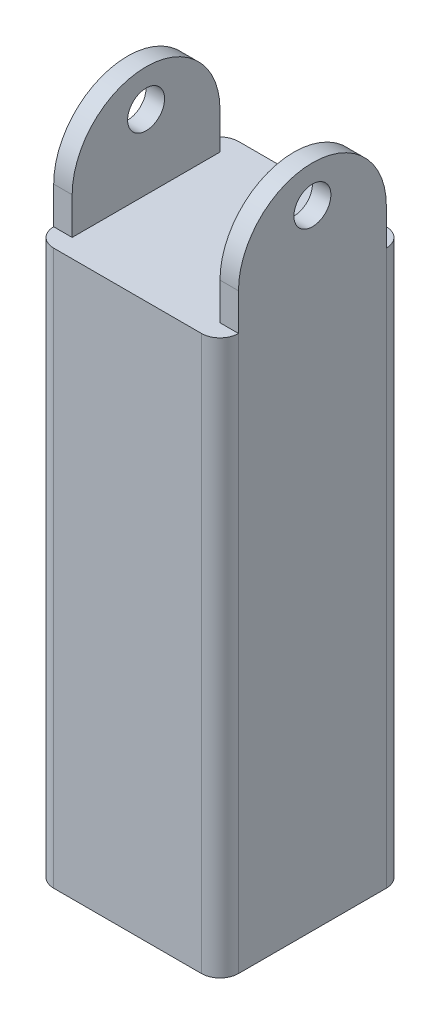
ISO-10303-21;
HEADER;
FILE_DESCRIPTION(('STEP AP214'),'2;1');
FILE_NAME('part.step','',(''),(''),'','','');
FILE_SCHEMA(('AUTOMOTIVE_DESIGN { 1 0 10303 214 1 1 1 1 }'));
ENDSEC;
DATA;
#1=APPLICATION_CONTEXT('core data for automotive mechanical design processes');
#2=APPLICATION_PROTOCOL_DEFINITION('international standard','automotive_design',2000,#1);
#3=PRODUCT_CONTEXT('',#1,'mechanical');
#4=PRODUCT('Part','Part','',(#3));
#5=PRODUCT_RELATED_PRODUCT_CATEGORY('part','',(#4));
#6=PRODUCT_DEFINITION_FORMATION('','',#4);
#7=PRODUCT_DEFINITION_CONTEXT('part definition',#1,'design');
#8=PRODUCT_DEFINITION('design','',#6,#7);
#9=PRODUCT_DEFINITION_SHAPE('','',#8);
#10=(LENGTH_UNIT() NAMED_UNIT(*) SI_UNIT(.MILLI.,.METRE.));
#11=(NAMED_UNIT(*) PLANE_ANGLE_UNIT() SI_UNIT($,.RADIAN.));
#12=(NAMED_UNIT(*) SI_UNIT($,.STERADIAN.) SOLID_ANGLE_UNIT());
#13=UNCERTAINTY_MEASURE_WITH_UNIT(LENGTH_MEASURE(1.E-05),#10,'distance_accuracy_value','');
#14=(GEOMETRIC_REPRESENTATION_CONTEXT(3) GLOBAL_UNCERTAINTY_ASSIGNED_CONTEXT((#13)) GLOBAL_UNIT_ASSIGNED_CONTEXT((#10,
#11,#12)) REPRESENTATION_CONTEXT('',''));
#15=CARTESIAN_POINT('',(0.,0.,0.));
#16=DIRECTION('',(0.,0.,1.));
#17=DIRECTION('',(1.,0.,0.));
#18=AXIS2_PLACEMENT_3D('',#15,#16,#17);
#19=CARTESIAN_POINT('',(-40.,320.,0.));
#20=DIRECTION('',(-1.,0.,0.));
#21=DIRECTION('',(0.,0.,1.));
#22=AXIS2_PLACEMENT_3D('',#19,#20,#21);
#23=CYLINDRICAL_SURFACE('',#22,40.);
#24=DIRECTION('',(-1.,0.,0.));
#25=VECTOR('',#24,1.);
#26=CARTESIAN_POINT('',(-40.,320.,40.));
#27=LINE('',#26,#25);
#28=CARTESIAN_POINT('',(-40.,320.,40.));
#29=VERTEX_POINT('',#28);
#30=CARTESIAN_POINT('',(-50.,320.,40.));
#31=VERTEX_POINT('',#30);
#32=EDGE_CURVE('E268',#29,#31,#27,.T.);
#33=ORIENTED_EDGE('',*,*,#32,.F.);
#34=CARTESIAN_POINT('',(-40.,320.,0.));
#35=DIRECTION('',(1.,0.,0.));
#36=DIRECTION('',(0.,0.,-1.));
#37=AXIS2_PLACEMENT_3D('',#34,#35,#36);
#38=CIRCLE('',#37,40.);
#39=CARTESIAN_POINT('',(-40.,320.,-40.));
#40=VERTEX_POINT('',#39);
#41=EDGE_CURVE('E56',#40,#29,#38,.T.);
#42=ORIENTED_EDGE('',*,*,#41,.F.);
#43=DIRECTION('',(-1.,0.,0.));
#44=VECTOR('',#43,1.);
#45=CARTESIAN_POINT('',(-40.,320.,-40.));
#46=LINE('',#45,#44);
#47=CARTESIAN_POINT('',(-50.,320.,-40.));
#48=VERTEX_POINT('',#47);
#49=EDGE_CURVE('E163',#48,#40,#46,.F.);
#50=ORIENTED_EDGE('',*,*,#49,.F.);
#51=CARTESIAN_POINT('',(-50.,320.,0.));
#52=DIRECTION('',(1.,0.,0.));
#53=DIRECTION('',(0.,0.,-1.));
#54=AXIS2_PLACEMENT_3D('',#51,#52,#53);
#55=CIRCLE('',#54,40.);
#56=EDGE_CURVE('E13',#31,#48,#55,.F.);
#57=ORIENTED_EDGE('',*,*,#56,.F.);
#58=EDGE_LOOP('',(#33,#42,#50,#57));
#59=FACE_BOUND('',#58,.T.);
#60=ADVANCED_FACE('F48',(#59),#23,.T.);
#61=CARTESIAN_POINT('',(0.,300.,0.));
#62=DIRECTION('',(0.,1.,0.));
#63=DIRECTION('',(0.,0.,1.));
#64=AXIS2_PLACEMENT_3D('',#61,#62,#63);
#65=PLANE('',#64);
#66=CARTESIAN_POINT('',(-40.,300.,-40.));
#67=DIRECTION('',(0.,1.,0.));
#68=DIRECTION('',(0.,0.,1.));
#69=AXIS2_PLACEMENT_3D('',#66,#67,#68);
#70=CIRCLE('',#69,10.);
#71=CARTESIAN_POINT('',(-40.,300.,-50.));
#72=VERTEX_POINT('',#71);
#73=CARTESIAN_POINT('',(-50.,300.,-40.));
#74=VERTEX_POINT('',#73);
#75=EDGE_CURVE('E170',#72,#74,#70,.T.);
#76=ORIENTED_EDGE('',*,*,#75,.T.);
#77=DIRECTION('',(-1.,0.,0.));
#78=VECTOR('',#77,1.);
#79=CARTESIAN_POINT('',(-40.,300.,-40.));
#80=LINE('',#79,#78);
#81=CARTESIAN_POINT('',(-40.,300.,-40.));
#82=VERTEX_POINT('',#81);
#83=EDGE_CURVE('E162',#82,#74,#80,.T.);
#84=ORIENTED_EDGE('',*,*,#83,.F.);
#85=DIRECTION('',(0.,0.,-1.));
#86=VECTOR('',#85,1.);
#87=CARTESIAN_POINT('',(-40.,300.,-40.));
#88=LINE('',#87,#86);
#89=CARTESIAN_POINT('',(-40.,300.,40.));
#90=VERTEX_POINT('',#89);
#91=EDGE_CURVE('E147',#90,#82,#88,.T.);
#92=ORIENTED_EDGE('',*,*,#91,.F.);
#93=DIRECTION('',(-1.,0.,0.));
#94=VECTOR('',#93,1.);
#95=CARTESIAN_POINT('',(-40.,300.,40.));
#96=LINE('',#95,#94);
#97=CARTESIAN_POINT('',(-50.,300.,40.));
#98=VERTEX_POINT('',#97);
#99=EDGE_CURVE('E172',#90,#98,#96,.T.);
#100=ORIENTED_EDGE('',*,*,#99,.T.);
#101=CARTESIAN_POINT('',(-40.,300.,40.));
#102=DIRECTION('',(0.,1.,0.));
#103=DIRECTION('',(0.,0.,1.));
#104=AXIS2_PLACEMENT_3D('',#101,#102,#103);
#105=CIRCLE('',#104,10.);
#106=CARTESIAN_POINT('',(-40.,300.,50.));
#107=VERTEX_POINT('',#106);
#108=EDGE_CURVE('E245',#98,#107,#105,.T.);
#109=ORIENTED_EDGE('',*,*,#108,.T.);
#110=DIRECTION('',(1.,0.,0.));
#111=VECTOR('',#110,1.);
#112=CARTESIAN_POINT('',(-50.,300.,50.));
#113=LINE('',#112,#111);
#114=CARTESIAN_POINT('',(40.,300.,50.));
#115=VERTEX_POINT('',#114);
#116=EDGE_CURVE('E206',#107,#115,#113,.T.);
#117=ORIENTED_EDGE('',*,*,#116,.T.);
#118=CARTESIAN_POINT('',(40.,300.,40.));
#119=DIRECTION('',(0.,1.,0.));
#120=DIRECTION('',(0.,0.,1.));
#121=AXIS2_PLACEMENT_3D('',#118,#119,#120);
#122=CIRCLE('',#121,10.);
#123=CARTESIAN_POINT('',(50.,300.,40.));
#124=VERTEX_POINT('',#123);
#125=EDGE_CURVE('E239',#115,#124,#122,.T.);
#126=ORIENTED_EDGE('',*,*,#125,.T.);
#127=DIRECTION('',(1.,0.,0.));
#128=VECTOR('',#127,1.);
#129=CARTESIAN_POINT('',(40.,300.,40.));
#130=LINE('',#129,#128);
#131=CARTESIAN_POINT('',(40.,300.,40.));
#132=VERTEX_POINT('',#131);
#133=EDGE_CURVE('E194',#132,#124,#130,.T.);
#134=ORIENTED_EDGE('',*,*,#133,.F.);
#135=DIRECTION('',(0.,0.,-1.));
#136=VECTOR('',#135,1.);
#137=CARTESIAN_POINT('',(40.,300.,-40.));
#138=LINE('',#137,#136);
#139=CARTESIAN_POINT('',(40.,300.,-40.));
#140=VERTEX_POINT('',#139);
#141=EDGE_CURVE('E191',#132,#140,#138,.T.);
#142=ORIENTED_EDGE('',*,*,#141,.T.);
#143=DIRECTION('',(1.,0.,0.));
#144=VECTOR('',#143,1.);
#145=CARTESIAN_POINT('',(40.,300.,-40.));
#146=LINE('',#145,#144);
#147=CARTESIAN_POINT('',(50.,300.,-40.));
#148=VERTEX_POINT('',#147);
#149=EDGE_CURVE('E198',#140,#148,#146,.T.);
#150=ORIENTED_EDGE('',*,*,#149,.T.);
#151=CARTESIAN_POINT('',(40.,300.,-40.));
#152=DIRECTION('',(0.,1.,0.));
#153=DIRECTION('',(0.,0.,1.));
#154=AXIS2_PLACEMENT_3D('',#151,#152,#153);
#155=CIRCLE('',#154,10.);
#156=CARTESIAN_POINT('',(40.,300.,-50.));
#157=VERTEX_POINT('',#156);
#158=EDGE_CURVE('E242',#148,#157,#155,.T.);
#159=ORIENTED_EDGE('',*,*,#158,.T.);
#160=DIRECTION('',(-1.,0.,0.));
#161=VECTOR('',#160,1.);
#162=CARTESIAN_POINT('',(-50.,300.,-50.));
#163=LINE('',#162,#161);
#164=EDGE_CURVE('E204',#157,#72,#163,.T.);
#165=ORIENTED_EDGE('',*,*,#164,.T.);
#166=EDGE_LOOP('',(#76,#84,#92,#100,#109,#117,#126,#134,#142,#150,#159,#165));
#167=FACE_BOUND('',#166,.T.);
#168=ADVANCED_FACE('F167',(#167),#65,.T.);
#169=CARTESIAN_POINT('',(50.,320.,0.));
#170=DIRECTION('',(1.,0.,0.));
#171=DIRECTION('',(0.,0.,-1.));
#172=AXIS2_PLACEMENT_3D('',#169,#170,#171);
#173=CYLINDRICAL_SURFACE('',#172,40.);
#174=DIRECTION('',(1.,0.,0.));
#175=VECTOR('',#174,1.);
#176=CARTESIAN_POINT('',(40.,320.,40.));
#177=LINE('',#176,#175);
#178=CARTESIAN_POINT('',(50.,320.,40.));
#179=VERTEX_POINT('',#178);
#180=CARTESIAN_POINT('',(40.,320.,40.));
#181=VERTEX_POINT('',#180);
#182=EDGE_CURVE('E258',#179,#181,#177,.F.);
#183=ORIENTED_EDGE('',*,*,#182,.F.);
#184=CARTESIAN_POINT('',(50.,320.,0.));
#185=DIRECTION('',(-1.,0.,0.));
#186=DIRECTION('',(0.,0.,1.));
#187=AXIS2_PLACEMENT_3D('',#184,#185,#186);
#188=CIRCLE('',#187,40.);
#189=CARTESIAN_POINT('',(50.,320.,-40.));
#190=VERTEX_POINT('',#189);
#191=EDGE_CURVE('E264',#190,#179,#188,.F.);
#192=ORIENTED_EDGE('',*,*,#191,.F.);
#193=DIRECTION('',(1.,0.,0.));
#194=VECTOR('',#193,1.);
#195=CARTESIAN_POINT('',(40.,320.,-40.));
#196=LINE('',#195,#194);
#197=CARTESIAN_POINT('',(40.,320.,-40.));
#198=VERTEX_POINT('',#197);
#199=EDGE_CURVE('E261',#198,#190,#196,.T.);
#200=ORIENTED_EDGE('',*,*,#199,.F.);
#201=CARTESIAN_POINT('',(40.,320.,0.));
#202=DIRECTION('',(-1.,0.,0.));
#203=DIRECTION('',(0.,0.,1.));
#204=AXIS2_PLACEMENT_3D('',#201,#202,#203);
#205=CIRCLE('',#204,40.);
#206=EDGE_CURVE('E266',#181,#198,#205,.T.);
#207=ORIENTED_EDGE('',*,*,#206,.F.);
#208=EDGE_LOOP('',(#183,#192,#200,#207));
#209=FACE_BOUND('',#208,.T.);
#210=ADVANCED_FACE('F346',(#209),#173,.T.);
#211=CARTESIAN_POINT('',(50.,300.,-50.));
#212=DIRECTION('',(-1.,0.,0.));
#213=DIRECTION('',(0.,0.,1.));
#214=AXIS2_PLACEMENT_3D('',#211,#212,#213);
#215=PLANE('',#214);
#216=DIRECTION('',(0.,1.,0.));
#217=VECTOR('',#216,1.);
#218=CARTESIAN_POINT('',(50.,360.,-40.));
#219=LINE('',#218,#217);
#220=EDGE_CURVE('E182',#148,#190,#219,.T.);
#221=ORIENTED_EDGE('',*,*,#220,.T.);
#222=ORIENTED_EDGE('',*,*,#191,.T.);
#223=DIRECTION('',(0.,-1.,0.));
#224=VECTOR('',#223,1.);
#225=CARTESIAN_POINT('',(50.,300.,40.));
#226=LINE('',#225,#224);
#227=EDGE_CURVE('E189',#179,#124,#226,.T.);
#228=ORIENTED_EDGE('',*,*,#227,.T.);
#229=DIRECTION('',(0.,-1.,0.));
#230=VECTOR('',#229,1.);
#231=CARTESIAN_POINT('',(50.,300.,40.));
#232=LINE('',#231,#230);
#233=CARTESIAN_POINT('',(50.,0.,40.));
#234=VERTEX_POINT('',#233);
#235=EDGE_CURVE('E252',#124,#234,#232,.T.);
#236=ORIENTED_EDGE('',*,*,#235,.T.);
#237=DIRECTION('',(0.,0.,-1.));
#238=VECTOR('',#237,1.);
#239=CARTESIAN_POINT('',(50.,0.,-50.));
#240=LINE('',#239,#238);
#241=CARTESIAN_POINT('',(50.,0.,-40.));
#242=VERTEX_POINT('',#241);
#243=EDGE_CURVE('E201',#234,#242,#240,.T.);
#244=ORIENTED_EDGE('',*,*,#243,.T.);
#245=DIRECTION('',(0.,-1.,0.));
#246=VECTOR('',#245,1.);
#247=CARTESIAN_POINT('',(50.,300.,-40.));
#248=LINE('',#247,#246);
#249=EDGE_CURVE('E255',#242,#148,#248,.F.);
#250=ORIENTED_EDGE('',*,*,#249,.T.);
#251=EDGE_LOOP('',(#221,#222,#228,#236,#244,#250));
#252=FACE_BOUND('',#251,.T.);
#253=CARTESIAN_POINT('',(50.,340.,0.));
#254=DIRECTION('',(1.,0.,0.));
#255=DIRECTION('',(0.,0.,-1.));
#256=AXIS2_PLACEMENT_3D('',#253,#254,#255);
#257=CIRCLE('',#256,10.);
#258=CARTESIAN_POINT('',(50.,340.,-10.));
#259=VERTEX_POINT('',#258);
#260=EDGE_CURVE('E174',#259,#259,#257,.T.);
#261=ORIENTED_EDGE('',*,*,#260,.F.);
#262=EDGE_LOOP('',(#261));
#263=FACE_BOUND('',#262,.T.);
#264=ADVANCED_FACE('F294',(#252,#263),#215,.F.);
#265=CARTESIAN_POINT('',(-50.,300.,-50.));
#266=DIRECTION('',(0.,0.,1.));
#267=DIRECTION('',(1.,0.,0.));
#268=AXIS2_PLACEMENT_3D('',#265,#266,#267);
#269=PLANE('',#268);
#270=DIRECTION('',(-1.,0.,0.));
#271=VECTOR('',#270,1.);
#272=CARTESIAN_POINT('',(-50.,0.,-50.));
#273=LINE('',#272,#271);
#274=CARTESIAN_POINT('',(40.,0.,-50.));
#275=VERTEX_POINT('',#274);
#276=CARTESIAN_POINT('',(-40.,0.,-50.));
#277=VERTEX_POINT('',#276);
#278=EDGE_CURVE('E213',#275,#277,#273,.T.);
#279=ORIENTED_EDGE('',*,*,#278,.T.);
#280=DIRECTION('',(0.,-1.,0.));
#281=VECTOR('',#280,1.);
#282=CARTESIAN_POINT('',(-40.,300.,-50.));
#283=LINE('',#282,#281);
#284=EDGE_CURVE('E250',#277,#72,#283,.F.);
#285=ORIENTED_EDGE('',*,*,#284,.T.);
#286=ORIENTED_EDGE('',*,*,#164,.F.);
#287=DIRECTION('',(0.,-1.,0.));
#288=VECTOR('',#287,1.);
#289=CARTESIAN_POINT('',(40.,300.,-50.));
#290=LINE('',#289,#288);
#291=EDGE_CURVE('E247',#157,#275,#290,.T.);
#292=ORIENTED_EDGE('',*,*,#291,.T.);
#293=EDGE_LOOP('',(#279,#285,#286,#292));
#294=FACE_BOUND('',#293,.T.);
#295=ADVANCED_FACE('F316',(#294),#269,.F.);
#296=CARTESIAN_POINT('',(-50.,300.,-50.));
#297=DIRECTION('',(1.,0.,0.));
#298=DIRECTION('',(0.,0.,-1.));
#299=AXIS2_PLACEMENT_3D('',#296,#297,#298);
#300=PLANE('',#299);
#301=DIRECTION('',(0.,-1.,0.));
#302=VECTOR('',#301,1.);
#303=CARTESIAN_POINT('',(-50.,300.,40.));
#304=LINE('',#303,#302);
#305=EDGE_CURVE('E164',#31,#98,#304,.T.);
#306=ORIENTED_EDGE('',*,*,#305,.F.);
#307=ORIENTED_EDGE('',*,*,#56,.T.);
#308=DIRECTION('',(0.,1.,0.));
#309=VECTOR('',#308,1.);
#310=CARTESIAN_POINT('',(-50.,360.,-40.));
#311=LINE('',#310,#309);
#312=EDGE_CURVE('E321',#74,#48,#311,.T.);
#313=ORIENTED_EDGE('',*,*,#312,.F.);
#314=DIRECTION('',(0.,-1.,0.));
#315=VECTOR('',#314,1.);
#316=CARTESIAN_POINT('',(-50.,300.,-40.));
#317=LINE('',#316,#315);
#318=CARTESIAN_POINT('',(-50.,0.,-40.));
#319=VERTEX_POINT('',#318);
#320=EDGE_CURVE('E233',#74,#319,#317,.T.);
#321=ORIENTED_EDGE('',*,*,#320,.T.);
#322=DIRECTION('',(0.,0.,1.));
#323=VECTOR('',#322,1.);
#324=CARTESIAN_POINT('',(-50.,0.,-50.));
#325=LINE('',#324,#323);
#326=CARTESIAN_POINT('',(-50.,0.,40.));
#327=VERTEX_POINT('',#326);
#328=EDGE_CURVE('E216',#319,#327,#325,.T.);
#329=ORIENTED_EDGE('',*,*,#328,.T.);
#330=DIRECTION('',(0.,-1.,0.));
#331=VECTOR('',#330,1.);
#332=CARTESIAN_POINT('',(-50.,300.,40.));
#333=LINE('',#332,#331);
#334=EDGE_CURVE('E236',#327,#98,#333,.F.);
#335=ORIENTED_EDGE('',*,*,#334,.T.);
#336=EDGE_LOOP('',(#306,#307,#313,#321,#329,#335));
#337=FACE_BOUND('',#336,.T.);
#338=CARTESIAN_POINT('',(-50.,340.,0.));
#339=DIRECTION('',(1.,0.,0.));
#340=DIRECTION('',(0.,0.,-1.));
#341=AXIS2_PLACEMENT_3D('',#338,#339,#340);
#342=CIRCLE('',#341,10.);
#343=CARTESIAN_POINT('',(-50.,340.,-10.));
#344=VERTEX_POINT('',#343);
#345=EDGE_CURVE('E325',#344,#344,#342,.T.);
#346=ORIENTED_EDGE('',*,*,#345,.T.);
#347=EDGE_LOOP('',(#346));
#348=FACE_BOUND('',#347,.T.);
#349=ADVANCED_FACE('F276',(#337,#348),#300,.F.);
#350=CARTESIAN_POINT('',(-50.,300.,50.));
#351=DIRECTION('',(0.,0.,-1.));
#352=DIRECTION('',(-1.,0.,0.));
#353=AXIS2_PLACEMENT_3D('',#350,#351,#352);
#354=PLANE('',#353);
#355=ORIENTED_EDGE('',*,*,#116,.F.);
#356=DIRECTION('',(0.,-1.,0.));
#357=VECTOR('',#356,1.);
#358=CARTESIAN_POINT('',(-40.,300.,50.));
#359=LINE('',#358,#357);
#360=CARTESIAN_POINT('',(-40.,0.,50.));
#361=VERTEX_POINT('',#360);
#362=EDGE_CURVE('E222',#107,#361,#359,.T.);
#363=ORIENTED_EDGE('',*,*,#362,.T.);
#364=DIRECTION('',(1.,0.,0.));
#365=VECTOR('',#364,1.);
#366=CARTESIAN_POINT('',(-50.,0.,50.));
#367=LINE('',#366,#365);
#368=CARTESIAN_POINT('',(40.,0.,50.));
#369=VERTEX_POINT('',#368);
#370=EDGE_CURVE('E207',#361,#369,#367,.T.);
#371=ORIENTED_EDGE('',*,*,#370,.T.);
#372=DIRECTION('',(0.,-1.,0.));
#373=VECTOR('',#372,1.);
#374=CARTESIAN_POINT('',(40.,300.,50.));
#375=LINE('',#374,#373);
#376=EDGE_CURVE('E210',#369,#115,#375,.F.);
#377=ORIENTED_EDGE('',*,*,#376,.T.);
#378=EDGE_LOOP('',(#355,#363,#371,#377));
#379=FACE_BOUND('',#378,.T.);
#380=ADVANCED_FACE('F284',(#379),#354,.F.);
#381=CARTESIAN_POINT('',(0.,0.,0.));
#382=DIRECTION('',(0.,1.,0.));
#383=DIRECTION('',(0.,0.,1.));
#384=AXIS2_PLACEMENT_3D('',#381,#382,#383);
#385=PLANE('',#384);
#386=ORIENTED_EDGE('',*,*,#370,.F.);
#387=CARTESIAN_POINT('',(-40.,0.,40.));
#388=DIRECTION('',(0.,1.,0.));
#389=DIRECTION('',(0.,0.,1.));
#390=AXIS2_PLACEMENT_3D('',#387,#388,#389);
#391=CIRCLE('',#390,10.);
#392=EDGE_CURVE('E231',#361,#327,#391,.F.);
#393=ORIENTED_EDGE('',*,*,#392,.T.);
#394=ORIENTED_EDGE('',*,*,#328,.F.);
#395=CARTESIAN_POINT('',(-40.,0.,-40.));
#396=DIRECTION('',(0.,1.,0.));
#397=DIRECTION('',(0.,0.,1.));
#398=AXIS2_PLACEMENT_3D('',#395,#396,#397);
#399=CIRCLE('',#398,10.);
#400=EDGE_CURVE('E229',#319,#277,#399,.F.);
#401=ORIENTED_EDGE('',*,*,#400,.T.);
#402=ORIENTED_EDGE('',*,*,#278,.F.);
#403=CARTESIAN_POINT('',(40.,0.,-40.));
#404=DIRECTION('',(0.,1.,0.));
#405=DIRECTION('',(0.,0.,1.));
#406=AXIS2_PLACEMENT_3D('',#403,#404,#405);
#407=CIRCLE('',#406,10.);
#408=EDGE_CURVE('E227',#275,#242,#407,.F.);
#409=ORIENTED_EDGE('',*,*,#408,.T.);
#410=ORIENTED_EDGE('',*,*,#243,.F.);
#411=CARTESIAN_POINT('',(40.,0.,40.));
#412=DIRECTION('',(0.,1.,0.));
#413=DIRECTION('',(0.,0.,1.));
#414=AXIS2_PLACEMENT_3D('',#411,#412,#413);
#415=CIRCLE('',#414,10.);
#416=EDGE_CURVE('E225',#234,#369,#415,.F.);
#417=ORIENTED_EDGE('',*,*,#416,.T.);
#418=EDGE_LOOP('',(#386,#393,#394,#401,#402,#409,#410,#417));
#419=FACE_BOUND('',#418,.T.);
#420=ADVANCED_FACE('F287',(#419),#385,.F.);
#421=CARTESIAN_POINT('',(-40.,300.,40.));
#422=DIRECTION('',(0.,-1.,0.));
#423=DIRECTION('',(0.,0.,-1.));
#424=AXIS2_PLACEMENT_3D('',#421,#422,#423);
#425=CYLINDRICAL_SURFACE('',#424,10.);
#426=ORIENTED_EDGE('',*,*,#108,.F.);
#427=ORIENTED_EDGE('',*,*,#334,.F.);
#428=ORIENTED_EDGE('',*,*,#392,.F.);
#429=ORIENTED_EDGE('',*,*,#362,.F.);
#430=EDGE_LOOP('',(#426,#427,#428,#429));
#431=FACE_BOUND('',#430,.T.);
#432=ADVANCED_FACE('F281',(#431),#425,.T.);
#433=CARTESIAN_POINT('',(-40.,300.,-40.));
#434=DIRECTION('',(0.,-1.,0.));
#435=DIRECTION('',(0.,0.,-1.));
#436=AXIS2_PLACEMENT_3D('',#433,#434,#435);
#437=CYLINDRICAL_SURFACE('',#436,10.);
#438=ORIENTED_EDGE('',*,*,#75,.F.);
#439=ORIENTED_EDGE('',*,*,#284,.F.);
#440=ORIENTED_EDGE('',*,*,#400,.F.);
#441=ORIENTED_EDGE('',*,*,#320,.F.);
#442=EDGE_LOOP('',(#438,#439,#440,#441));
#443=FACE_BOUND('',#442,.T.);
#444=ADVANCED_FACE('F320',(#443),#437,.T.);
#445=CARTESIAN_POINT('',(40.,300.,-40.));
#446=DIRECTION('',(0.,-1.,0.));
#447=DIRECTION('',(0.,0.,-1.));
#448=AXIS2_PLACEMENT_3D('',#445,#446,#447);
#449=CYLINDRICAL_SURFACE('',#448,10.);
#450=ORIENTED_EDGE('',*,*,#158,.F.);
#451=ORIENTED_EDGE('',*,*,#249,.F.);
#452=ORIENTED_EDGE('',*,*,#408,.F.);
#453=ORIENTED_EDGE('',*,*,#291,.F.);
#454=EDGE_LOOP('',(#450,#451,#452,#453));
#455=FACE_BOUND('',#454,.T.);
#456=ADVANCED_FACE('F313',(#455),#449,.T.);
#457=CARTESIAN_POINT('',(40.,300.,40.));
#458=DIRECTION('',(0.,-1.,0.));
#459=DIRECTION('',(0.,0.,-1.));
#460=AXIS2_PLACEMENT_3D('',#457,#458,#459);
#461=CYLINDRICAL_SURFACE('',#460,10.);
#462=ORIENTED_EDGE('',*,*,#125,.F.);
#463=ORIENTED_EDGE('',*,*,#376,.F.);
#464=ORIENTED_EDGE('',*,*,#416,.F.);
#465=ORIENTED_EDGE('',*,*,#235,.F.);
#466=EDGE_LOOP('',(#462,#463,#464,#465));
#467=FACE_BOUND('',#466,.T.);
#468=ADVANCED_FACE('F292',(#467),#461,.T.);
#469=CARTESIAN_POINT('',(40.,360.,-40.));
#470=DIRECTION('',(0.,0.,-1.));
#471=DIRECTION('',(-1.,0.,0.));
#472=AXIS2_PLACEMENT_3D('',#469,#470,#471);
#473=PLANE('',#472);
#474=DIRECTION('',(0.,1.,0.));
#475=VECTOR('',#474,1.);
#476=CARTESIAN_POINT('',(40.,360.,-40.));
#477=LINE('',#476,#475);
#478=EDGE_CURVE('E185',#140,#198,#477,.T.);
#479=ORIENTED_EDGE('',*,*,#478,.T.);
#480=ORIENTED_EDGE('',*,*,#199,.T.);
#481=ORIENTED_EDGE('',*,*,#220,.F.);
#482=ORIENTED_EDGE('',*,*,#149,.F.);
#483=EDGE_LOOP('',(#479,#480,#481,#482));
#484=FACE_BOUND('',#483,.T.);
#485=ADVANCED_FACE('F309',(#484),#473,.T.);
#486=CARTESIAN_POINT('',(40.,300.,40.));
#487=DIRECTION('',(0.,0.,1.));
#488=DIRECTION('',(1.,0.,0.));
#489=AXIS2_PLACEMENT_3D('',#486,#487,#488);
#490=PLANE('',#489);
#491=ORIENTED_EDGE('',*,*,#227,.F.);
#492=ORIENTED_EDGE('',*,*,#182,.T.);
#493=DIRECTION('',(0.,-1.,0.));
#494=VECTOR('',#493,1.);
#495=CARTESIAN_POINT('',(40.,300.,40.));
#496=LINE('',#495,#494);
#497=EDGE_CURVE('E188',#181,#132,#496,.T.);
#498=ORIENTED_EDGE('',*,*,#497,.T.);
#499=ORIENTED_EDGE('',*,*,#133,.T.);
#500=EDGE_LOOP('',(#491,#492,#498,#499));
#501=FACE_BOUND('',#500,.T.);
#502=ADVANCED_FACE('F301',(#501),#490,.T.);
#503=CARTESIAN_POINT('',(40.,0.,0.));
#504=DIRECTION('',(-1.,0.,0.));
#505=DIRECTION('',(0.,0.,1.));
#506=AXIS2_PLACEMENT_3D('',#503,#504,#505);
#507=PLANE('',#506);
#508=CARTESIAN_POINT('',(40.,340.,0.));
#509=DIRECTION('',(1.,0.,0.));
#510=DIRECTION('',(0.,0.,-1.));
#511=AXIS2_PLACEMENT_3D('',#508,#509,#510);
#512=CIRCLE('',#511,10.);
#513=CARTESIAN_POINT('',(40.,340.,-10.));
#514=VERTEX_POINT('',#513);
#515=EDGE_CURVE('E179',#514,#514,#512,.T.);
#516=ORIENTED_EDGE('',*,*,#515,.T.);
#517=EDGE_LOOP('',(#516));
#518=FACE_BOUND('',#517,.T.);
#519=ORIENTED_EDGE('',*,*,#497,.F.);
#520=ORIENTED_EDGE('',*,*,#206,.T.);
#521=ORIENTED_EDGE('',*,*,#478,.F.);
#522=ORIENTED_EDGE('',*,*,#141,.F.);
#523=EDGE_LOOP('',(#519,#520,#521,#522));
#524=FACE_BOUND('',#523,.T.);
#525=ADVANCED_FACE('F306',(#518,#524),#507,.T.);
#526=CARTESIAN_POINT('',(40.,340.,0.));
#527=DIRECTION('',(1.,0.,0.));
#528=DIRECTION('',(0.,0.,-1.));
#529=AXIS2_PLACEMENT_3D('',#526,#527,#528);
#530=CYLINDRICAL_SURFACE('',#529,10.);
#531=ORIENTED_EDGE('',*,*,#515,.F.);
#532=EDGE_LOOP('',(#531));
#533=FACE_BOUND('',#532,.T.);
#534=ORIENTED_EDGE('',*,*,#260,.T.);
#535=EDGE_LOOP('',(#534));
#536=FACE_BOUND('',#535,.T.);
#537=ADVANCED_FACE('F387',(#533,#536),#530,.F.);
#538=CARTESIAN_POINT('',(-40.,0.,0.));
#539=DIRECTION('',(1.,0.,0.));
#540=DIRECTION('',(0.,0.,1.));
#541=AXIS2_PLACEMENT_3D('',#538,#539,#540);
#542=PLANE('',#541);
#543=DIRECTION('',(0.,1.,0.));
#544=VECTOR('',#543,1.);
#545=CARTESIAN_POINT('',(-40.,360.,-40.));
#546=LINE('',#545,#544);
#547=EDGE_CURVE('E151',#82,#40,#546,.T.);
#548=ORIENTED_EDGE('',*,*,#547,.T.);
#549=ORIENTED_EDGE('',*,*,#41,.T.);
#550=DIRECTION('',(0.,-1.,0.));
#551=VECTOR('',#550,1.);
#552=CARTESIAN_POINT('',(-40.,300.,40.));
#553=LINE('',#552,#551);
#554=EDGE_CURVE('E153',#29,#90,#553,.T.);
#555=ORIENTED_EDGE('',*,*,#554,.T.);
#556=ORIENTED_EDGE('',*,*,#91,.T.);
#557=EDGE_LOOP('',(#548,#549,#555,#556));
#558=FACE_BOUND('',#557,.T.);
#559=CARTESIAN_POINT('',(-40.,340.,0.));
#560=DIRECTION('',(1.,0.,0.));
#561=DIRECTION('',(0.,0.,-1.));
#562=AXIS2_PLACEMENT_3D('',#559,#560,#561);
#563=CIRCLE('',#562,10.);
#564=CARTESIAN_POINT('',(-40.,340.,-10.));
#565=VERTEX_POINT('',#564);
#566=EDGE_CURVE('E322',#565,#565,#563,.T.);
#567=ORIENTED_EDGE('',*,*,#566,.F.);
#568=EDGE_LOOP('',(#567));
#569=FACE_BOUND('',#568,.T.);
#570=ADVANCED_FACE('F149',(#558,#569),#542,.T.);
#571=CARTESIAN_POINT('',(-40.,360.,-40.));
#572=DIRECTION('',(0.,0.,1.));
#573=DIRECTION('',(1.,0.,0.));
#574=AXIS2_PLACEMENT_3D('',#571,#572,#573);
#575=PLANE('',#574);
#576=ORIENTED_EDGE('',*,*,#312,.T.);
#577=ORIENTED_EDGE('',*,*,#49,.T.);
#578=ORIENTED_EDGE('',*,*,#547,.F.);
#579=ORIENTED_EDGE('',*,*,#83,.T.);
#580=EDGE_LOOP('',(#576,#577,#578,#579));
#581=FACE_BOUND('',#580,.T.);
#582=ADVANCED_FACE('F161',(#581),#575,.F.);
#583=CARTESIAN_POINT('',(-40.,300.,40.));
#584=DIRECTION('',(0.,0.,-1.));
#585=DIRECTION('',(-1.,0.,0.));
#586=AXIS2_PLACEMENT_3D('',#583,#584,#585);
#587=PLANE('',#586);
#588=ORIENTED_EDGE('',*,*,#554,.F.);
#589=ORIENTED_EDGE('',*,*,#32,.T.);
#590=ORIENTED_EDGE('',*,*,#305,.T.);
#591=ORIENTED_EDGE('',*,*,#99,.F.);
#592=EDGE_LOOP('',(#588,#589,#590,#591));
#593=FACE_BOUND('',#592,.T.);
#594=ADVANCED_FACE('F272',(#593),#587,.F.);
#595=CARTESIAN_POINT('',(-40.,340.,0.));
#596=DIRECTION('',(-1.,0.,0.));
#597=DIRECTION('',(0.,0.,1.));
#598=AXIS2_PLACEMENT_3D('',#595,#596,#597);
#599=CYLINDRICAL_SURFACE('',#598,10.);
#600=ORIENTED_EDGE('',*,*,#566,.T.);
#601=EDGE_LOOP('',(#600));
#602=FACE_BOUND('',#601,.T.);
#603=ORIENTED_EDGE('',*,*,#345,.F.);
#604=EDGE_LOOP('',(#603));
#605=FACE_BOUND('',#604,.T.);
#606=ADVANCED_FACE('F331',(#602,#605),#599,.F.);
#607=CLOSED_SHELL('',(#60,#168,#210,#264,#295,#349,#380,#420,#432,#444,#456,#468,#485,#502,#525,
#537,#570,#582,#594,#606));
#608=MANIFOLD_SOLID_BREP('B2',#607);
#609=ADVANCED_BREP_SHAPE_REPRESENTATION('',(#18,#608),#14);
#610=SHAPE_DEFINITION_REPRESENTATION(#9,#609);
ENDSEC;
END-ISO-10303-21;
